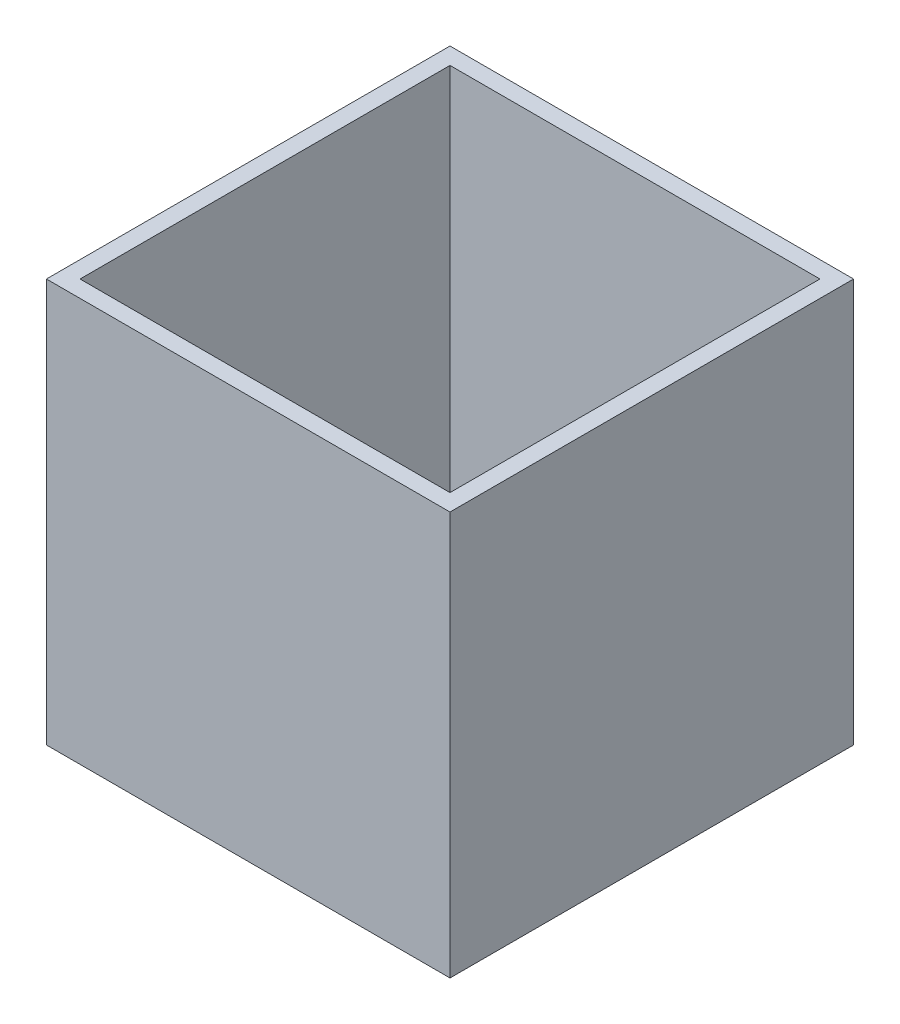
ISO-10303-21;
HEADER;
FILE_DESCRIPTION(('STEP AP214'),'2;1');
FILE_NAME('part.step','',(''),(''),'','','');
FILE_SCHEMA(('AUTOMOTIVE_DESIGN { 1 0 10303 214 1 1 1 1 }'));
ENDSEC;
DATA;
#1=APPLICATION_CONTEXT('core data for automotive mechanical design processes');
#2=APPLICATION_PROTOCOL_DEFINITION('international standard','automotive_design',2000,#1);
#3=PRODUCT_CONTEXT('',#1,'mechanical');
#4=PRODUCT('Part','Part','',(#3));
#5=PRODUCT_RELATED_PRODUCT_CATEGORY('part','',(#4));
#6=PRODUCT_DEFINITION_FORMATION('','',#4);
#7=PRODUCT_DEFINITION_CONTEXT('part definition',#1,'design');
#8=PRODUCT_DEFINITION('design','',#6,#7);
#9=PRODUCT_DEFINITION_SHAPE('','',#8);
#10=(LENGTH_UNIT() NAMED_UNIT(*) SI_UNIT(.MILLI.,.METRE.));
#11=(NAMED_UNIT(*) PLANE_ANGLE_UNIT() SI_UNIT($,.RADIAN.));
#12=(NAMED_UNIT(*) SI_UNIT($,.STERADIAN.) SOLID_ANGLE_UNIT());
#13=UNCERTAINTY_MEASURE_WITH_UNIT(LENGTH_MEASURE(1.E-05),#10,'distance_accuracy_value','');
#14=(GEOMETRIC_REPRESENTATION_CONTEXT(3) GLOBAL_UNCERTAINTY_ASSIGNED_CONTEXT((#13)) GLOBAL_UNIT_ASSIGNED_CONTEXT((#10,
#11,#12)) REPRESENTATION_CONTEXT('',''));
#15=CARTESIAN_POINT('',(0.,0.,0.));
#16=DIRECTION('',(0.,0.,1.));
#17=DIRECTION('',(1.,0.,0.));
#18=AXIS2_PLACEMENT_3D('',#15,#16,#17);
#19=CARTESIAN_POINT('',(-11.0771927684468,-36.9452985585913,304.8));
#20=DIRECTION('',(0.,1.,0.));
#21=DIRECTION('',(0.,0.,1.));
#22=AXIS2_PLACEMENT_3D('',#19,#20,#21);
#23=PLANE('',#22);
#24=CARTESIAN_POINT('',(115.822807231553,-36.9452985585913,131.4));
#25=DIRECTION('',(0.,1.,0.));
#26=DIRECTION('',(0.,0.,1.));
#27=AXIS2_PLACEMENT_3D('',#24,#25,#26);
#28=CIRCLE('',#27,3.87779457302715);
#29=CARTESIAN_POINT('',(115.822807231553,-36.9452985585913,135.277794573027));
#30=VERTEX_POINT('',#29);
#31=EDGE_CURVE('E237',#30,#30,#28,.T.);
#32=ORIENTED_EDGE('',*,*,#31,.F.);
#33=EDGE_LOOP('',(#32));
#34=FACE_BOUND('',#33,.T.);
#35=DIRECTION('',(1.,0.,0.));
#36=VECTOR('',#35,1.);
#37=CARTESIAN_POINT('',(-11.0771927684468,-36.9452985585913,12.7));
#38=LINE('',#37,#36);
#39=CARTESIAN_POINT('',(1.62280723155324,-36.9452985585913,12.7));
#40=VERTEX_POINT('',#39);
#41=CARTESIAN_POINT('',(281.022807231553,-36.9452985585913,12.7));
#42=VERTEX_POINT('',#41);
#43=EDGE_CURVE('E314',#40,#42,#38,.T.);
#44=ORIENTED_EDGE('',*,*,#43,.F.);
#45=DIRECTION('',(0.,0.,-1.));
#46=VECTOR('',#45,1.);
#47=CARTESIAN_POINT('',(1.62280723155324,-36.9452985585913,304.8));
#48=LINE('',#47,#46);
#49=CARTESIAN_POINT('',(1.62280723155324,-36.9452985585913,292.1));
#50=VERTEX_POINT('',#49);
#51=EDGE_CURVE('E315',#50,#40,#48,.T.);
#52=ORIENTED_EDGE('',*,*,#51,.F.);
#53=DIRECTION('',(1.,0.,0.));
#54=VECTOR('',#53,1.);
#55=CARTESIAN_POINT('',(-11.0771927684468,-36.9452985585913,292.1));
#56=LINE('',#55,#54);
#57=CARTESIAN_POINT('',(281.022807231553,-36.9452985585913,292.1));
#58=VERTEX_POINT('',#57);
#59=EDGE_CURVE('E325',#50,#58,#56,.T.);
#60=ORIENTED_EDGE('',*,*,#59,.T.);
#61=DIRECTION('',(0.,0.,-1.));
#62=VECTOR('',#61,1.);
#63=CARTESIAN_POINT('',(281.022807231553,-36.9452985585914,304.8));
#64=LINE('',#63,#62);
#65=EDGE_CURVE('E320',#58,#42,#64,.T.);
#66=ORIENTED_EDGE('',*,*,#65,.T.);
#67=EDGE_LOOP('',(#44,#52,#60,#66));
#68=FACE_BOUND('',#67,.T.);
#69=CARTESIAN_POINT('',(115.822807231553,-36.9452985585913,173.4));
#70=DIRECTION('',(0.,1.,0.));
#71=DIRECTION('',(0.,0.,1.));
#72=AXIS2_PLACEMENT_3D('',#69,#70,#71);
#73=CIRCLE('',#72,3.87779457302714);
#74=CARTESIAN_POINT('',(117.492325350832,-36.9452985585913,176.9));
#75=VERTEX_POINT('',#74);
#76=CARTESIAN_POINT('',(112.322807231553,-36.9452985585913,171.730481880722));
#77=VERTEX_POINT('',#76);
#78=EDGE_CURVE('E220',#75,#77,#73,.T.);
#79=ORIENTED_EDGE('',*,*,#78,.F.);
#80=DIRECTION('',(1.,0.,0.));
#81=VECTOR('',#80,1.);
#82=CARTESIAN_POINT('',(0.,-36.9452985585913,176.9));
#83=LINE('',#82,#81);
#84=CARTESIAN_POINT('',(114.153289112275,-36.9452985585913,176.9));
#85=VERTEX_POINT('',#84);
#86=EDGE_CURVE('E215',#85,#75,#83,.T.);
#87=ORIENTED_EDGE('',*,*,#86,.F.);
#88=CARTESIAN_POINT('',(112.322807231553,-36.9452985585913,175.069518119278));
#89=VERTEX_POINT('',#88);
#90=EDGE_CURVE('E283',#89,#85,#73,.T.);
#91=ORIENTED_EDGE('',*,*,#90,.F.);
#92=DIRECTION('',(0.,0.,1.));
#93=VECTOR('',#92,1.);
#94=CARTESIAN_POINT('',(112.322807231553,-36.9452985585913,0.));
#95=LINE('',#94,#93);
#96=EDGE_CURVE('E292',#77,#89,#95,.T.);
#97=ORIENTED_EDGE('',*,*,#96,.F.);
#98=EDGE_LOOP('',(#79,#87,#91,#97));
#99=FACE_BOUND('',#98,.T.);
#100=CARTESIAN_POINT('',(166.822807231553,-36.9452985585913,173.4));
#101=DIRECTION('',(0.,1.,0.));
#102=DIRECTION('',(0.,0.,1.));
#103=AXIS2_PLACEMENT_3D('',#100,#101,#102);
#104=CIRCLE('',#103,3.87779457302715);
#105=CARTESIAN_POINT('',(168.492325350832,-36.9452985585913,176.9));
#106=VERTEX_POINT('',#105);
#107=CARTESIAN_POINT('',(170.322807231553,-36.9452985585913,175.069518119278));
#108=VERTEX_POINT('',#107);
#109=EDGE_CURVE('E201',#106,#108,#104,.T.);
#110=ORIENTED_EDGE('',*,*,#109,.F.);
#111=DIRECTION('',(1.,0.,0.));
#112=VECTOR('',#111,1.);
#113=CARTESIAN_POINT('',(0.,-36.9452985585913,176.9));
#114=LINE('',#113,#112);
#115=CARTESIAN_POINT('',(165.153289112275,-36.9452985585913,176.9));
#116=VERTEX_POINT('',#115);
#117=EDGE_CURVE('E206',#116,#106,#114,.T.);
#118=ORIENTED_EDGE('',*,*,#117,.F.);
#119=CARTESIAN_POINT('',(170.322807231553,-36.9452985585913,171.730481880722));
#120=VERTEX_POINT('',#119);
#121=EDGE_CURVE('E189',#120,#116,#104,.T.);
#122=ORIENTED_EDGE('',*,*,#121,.F.);
#123=DIRECTION('',(0.,0.,1.));
#124=VECTOR('',#123,1.);
#125=CARTESIAN_POINT('',(170.322807231553,-36.9452985585913,0.));
#126=LINE('',#125,#124);
#127=EDGE_CURVE('E75',#120,#108,#126,.T.);
#128=ORIENTED_EDGE('',*,*,#127,.T.);
#129=EDGE_LOOP('',(#110,#118,#122,#128));
#130=FACE_BOUND('',#129,.T.);
#131=DIRECTION('',(0.,0.,1.));
#132=VECTOR('',#131,1.);
#133=CARTESIAN_POINT('',(170.322807231553,-36.9452985585913,0.));
#134=LINE('',#133,#132);
#135=CARTESIAN_POINT('',(170.322807231553,-36.9452985585913,129.730481880722));
#136=VERTEX_POINT('',#135);
#137=CARTESIAN_POINT('',(170.322807231553,-36.9452985585913,133.069518119278));
#138=VERTEX_POINT('',#137);
#139=EDGE_CURVE('E254',#136,#138,#134,.T.);
#140=ORIENTED_EDGE('',*,*,#139,.T.);
#141=CARTESIAN_POINT('',(166.822807231553,-36.9452985585913,131.4));
#142=DIRECTION('',(0.,1.,0.));
#143=DIRECTION('',(0.,0.,1.));
#144=AXIS2_PLACEMENT_3D('',#141,#142,#143);
#145=CIRCLE('',#144,3.87779457302718);
#146=CARTESIAN_POINT('',(165.153289112275,-36.9452985585913,127.9));
#147=VERTEX_POINT('',#146);
#148=EDGE_CURVE('E250',#147,#138,#145,.T.);
#149=ORIENTED_EDGE('',*,*,#148,.F.);
#150=DIRECTION('',(1.,0.,0.));
#151=VECTOR('',#150,1.);
#152=CARTESIAN_POINT('',(0.,-36.9452985585913,127.9));
#153=LINE('',#152,#151);
#154=CARTESIAN_POINT('',(168.492325350832,-36.9452985585913,127.9));
#155=VERTEX_POINT('',#154);
#156=EDGE_CURVE('E67',#147,#155,#153,.T.);
#157=ORIENTED_EDGE('',*,*,#156,.T.);
#158=EDGE_CURVE('E249',#136,#155,#145,.T.);
#159=ORIENTED_EDGE('',*,*,#158,.F.);
#160=EDGE_LOOP('',(#140,#149,#157,#159));
#161=FACE_BOUND('',#160,.T.);
#162=ADVANCED_FACE('F51',(#34,#68,#99,#130,#161),#23,.T.);
#163=CARTESIAN_POINT('',(-11.0771927684467,255.154701441409,304.8));
#164=DIRECTION('',(0.,-1.,0.));
#165=DIRECTION('',(0.,0.,-1.));
#166=AXIS2_PLACEMENT_3D('',#163,#164,#165);
#167=PLANE('',#166);
#168=DIRECTION('',(-1.,0.,0.));
#169=VECTOR('',#168,1.);
#170=CARTESIAN_POINT('',(-11.0771927684467,255.154701441409,0.));
#171=LINE('',#170,#169);
#172=CARTESIAN_POINT('',(293.722807231553,255.154701441409,0.));
#173=VERTEX_POINT('',#172);
#174=CARTESIAN_POINT('',(-11.0771927684467,255.154701441409,0.));
#175=VERTEX_POINT('',#174);
#176=EDGE_CURVE('E360',#173,#175,#171,.T.);
#177=ORIENTED_EDGE('',*,*,#176,.T.);
#178=DIRECTION('',(0.,0.,-1.));
#179=VECTOR('',#178,1.);
#180=CARTESIAN_POINT('',(-11.0771927684467,255.154701441409,304.8));
#181=LINE('',#180,#179);
#182=CARTESIAN_POINT('',(-11.0771927684467,255.154701441409,304.8));
#183=VERTEX_POINT('',#182);
#184=EDGE_CURVE('E369',#183,#175,#181,.T.);
#185=ORIENTED_EDGE('',*,*,#184,.F.);
#186=DIRECTION('',(-1.,0.,0.));
#187=VECTOR('',#186,1.);
#188=CARTESIAN_POINT('',(-11.0771927684467,255.154701441409,304.8));
#189=LINE('',#188,#187);
#190=CARTESIAN_POINT('',(293.722807231553,255.154701441409,304.8));
#191=VERTEX_POINT('',#190);
#192=EDGE_CURVE('E366',#191,#183,#189,.T.);
#193=ORIENTED_EDGE('',*,*,#192,.F.);
#194=DIRECTION('',(0.,0.,-1.));
#195=VECTOR('',#194,1.);
#196=CARTESIAN_POINT('',(293.722807231553,255.154701441409,304.8));
#197=LINE('',#196,#195);
#198=EDGE_CURVE('E384',#191,#173,#197,.T.);
#199=ORIENTED_EDGE('',*,*,#198,.T.);
#200=EDGE_LOOP('',(#177,#185,#193,#199));
#201=FACE_BOUND('',#200,.T.);
#202=DIRECTION('',(-1.,0.,0.));
#203=VECTOR('',#202,1.);
#204=CARTESIAN_POINT('',(-11.0771927684467,255.154701441409,12.7));
#205=LINE('',#204,#203);
#206=CARTESIAN_POINT('',(281.022807231553,255.154701441409,12.7));
#207=VERTEX_POINT('',#206);
#208=CARTESIAN_POINT('',(1.62280723155329,255.154701441409,12.7));
#209=VERTEX_POINT('',#208);
#210=EDGE_CURVE('E326',#207,#209,#205,.T.);
#211=ORIENTED_EDGE('',*,*,#210,.F.);
#212=DIRECTION('',(0.,0.,-1.));
#213=VECTOR('',#212,1.);
#214=CARTESIAN_POINT('',(281.022807231553,255.154701441409,304.8));
#215=LINE('',#214,#213);
#216=CARTESIAN_POINT('',(281.022807231553,255.154701441409,292.1));
#217=VERTEX_POINT('',#216);
#218=EDGE_CURVE('E333',#217,#207,#215,.T.);
#219=ORIENTED_EDGE('',*,*,#218,.F.);
#220=DIRECTION('',(-1.,0.,0.));
#221=VECTOR('',#220,1.);
#222=CARTESIAN_POINT('',(-11.0771927684467,255.154701441409,292.1));
#223=LINE('',#222,#221);
#224=CARTESIAN_POINT('',(1.62280723155329,255.154701441409,292.1));
#225=VERTEX_POINT('',#224);
#226=EDGE_CURVE('E342',#217,#225,#223,.T.);
#227=ORIENTED_EDGE('',*,*,#226,.T.);
#228=DIRECTION('',(0.,0.,-1.));
#229=VECTOR('',#228,1.);
#230=CARTESIAN_POINT('',(1.62280723155329,255.154701441409,304.8));
#231=LINE('',#230,#229);
#232=EDGE_CURVE('E343',#225,#209,#231,.T.);
#233=ORIENTED_EDGE('',*,*,#232,.T.);
#234=EDGE_LOOP('',(#211,#219,#227,#233));
#235=FACE_BOUND('',#234,.T.);
#236=ADVANCED_FACE('F402',(#201,#235),#167,.F.);
#237=CARTESIAN_POINT('',(-11.0771927684467,255.154701441409,304.8));
#238=DIRECTION('',(1.,0.,0.));
#239=DIRECTION('',(0.,1.,0.));
#240=AXIS2_PLACEMENT_3D('',#237,#238,#239);
#241=PLANE('',#240);
#242=DIRECTION('',(0.,-1.,0.));
#243=VECTOR('',#242,1.);
#244=CARTESIAN_POINT('',(-11.0771927684467,255.154701441409,0.));
#245=LINE('',#244,#243);
#246=CARTESIAN_POINT('',(-11.0771927684468,-49.6452985585913,0.));
#247=VERTEX_POINT('',#246);
#248=EDGE_CURVE('E319',#175,#247,#245,.T.);
#249=ORIENTED_EDGE('',*,*,#248,.T.);
#250=DIRECTION('',(0.,0.,-1.));
#251=VECTOR('',#250,1.);
#252=CARTESIAN_POINT('',(-11.0771927684468,-49.6452985585913,304.8));
#253=LINE('',#252,#251);
#254=CARTESIAN_POINT('',(-11.0771927684468,-49.6452985585913,304.8));
#255=VERTEX_POINT('',#254);
#256=EDGE_CURVE('E11',#255,#247,#253,.T.);
#257=ORIENTED_EDGE('',*,*,#256,.F.);
#258=DIRECTION('',(0.,-1.,0.));
#259=VECTOR('',#258,1.);
#260=CARTESIAN_POINT('',(-11.0771927684467,255.154701441409,304.8));
#261=LINE('',#260,#259);
#262=EDGE_CURVE('E355',#183,#255,#261,.T.);
#263=ORIENTED_EDGE('',*,*,#262,.F.);
#264=ORIENTED_EDGE('',*,*,#184,.T.);
#265=EDGE_LOOP('',(#249,#257,#263,#264));
#266=FACE_BOUND('',#265,.T.);
#267=ADVANCED_FACE('F53',(#266),#241,.F.);
#268=CARTESIAN_POINT('',(-11.0771927684468,-49.6452985585913,304.8));
#269=DIRECTION('',(0.,1.,0.));
#270=DIRECTION('',(0.,0.,1.));
#271=AXIS2_PLACEMENT_3D('',#268,#269,#270);
#272=PLANE('',#271);
#273=CARTESIAN_POINT('',(115.822807231553,-49.6452985585913,131.4));
#274=DIRECTION('',(0.,1.,0.));
#275=DIRECTION('',(0.,0.,1.));
#276=AXIS2_PLACEMENT_3D('',#273,#274,#275);
#277=CIRCLE('',#276,1.02499999999999);
#278=CARTESIAN_POINT('',(115.822807231553,-49.6452985585913,132.425));
#279=VERTEX_POINT('',#278);
#280=EDGE_CURVE('E707',#279,#279,#277,.T.);
#281=ORIENTED_EDGE('',*,*,#280,.T.);
#282=EDGE_LOOP('',(#281));
#283=FACE_BOUND('',#282,.T.);
#284=CARTESIAN_POINT('',(166.822807231553,-49.6452985585913,131.4));
#285=DIRECTION('',(0.,1.,0.));
#286=DIRECTION('',(0.,0.,1.));
#287=AXIS2_PLACEMENT_3D('',#284,#285,#286);
#288=CIRCLE('',#287,1.025);
#289=CARTESIAN_POINT('',(166.822807231553,-49.6452985585913,132.425));
#290=VERTEX_POINT('',#289);
#291=EDGE_CURVE('E720',#290,#290,#288,.T.);
#292=ORIENTED_EDGE('',*,*,#291,.T.);
#293=EDGE_LOOP('',(#292));
#294=FACE_BOUND('',#293,.T.);
#295=CARTESIAN_POINT('',(166.822807231553,-49.6452985585913,173.4));
#296=DIRECTION('',(0.,1.,0.));
#297=DIRECTION('',(0.,0.,1.));
#298=AXIS2_PLACEMENT_3D('',#295,#296,#297);
#299=CIRCLE('',#298,1.025);
#300=CARTESIAN_POINT('',(166.822807231553,-49.6452985585913,174.425));
#301=VERTEX_POINT('',#300);
#302=EDGE_CURVE('E728',#301,#301,#299,.T.);
#303=ORIENTED_EDGE('',*,*,#302,.T.);
#304=EDGE_LOOP('',(#303));
#305=FACE_BOUND('',#304,.T.);
#306=CARTESIAN_POINT('',(115.822807231553,-49.6452985585913,173.4));
#307=DIRECTION('',(0.,1.,0.));
#308=DIRECTION('',(0.,0.,1.));
#309=AXIS2_PLACEMENT_3D('',#306,#307,#308);
#310=CIRCLE('',#309,1.02499999999999);
#311=CARTESIAN_POINT('',(115.822807231553,-49.6452985585913,174.425));
#312=VERTEX_POINT('',#311);
#313=EDGE_CURVE('E277',#312,#312,#310,.T.);
#314=ORIENTED_EDGE('',*,*,#313,.T.);
#315=EDGE_LOOP('',(#314));
#316=FACE_BOUND('',#315,.T.);
#317=DIRECTION('',(1.,0.,0.));
#318=VECTOR('',#317,1.);
#319=CARTESIAN_POINT('',(-11.0771927684468,-49.6452985585913,0.));
#320=LINE('',#319,#318);
#321=CARTESIAN_POINT('',(293.722807231553,-49.6452985585913,0.));
#322=VERTEX_POINT('',#321);
#323=EDGE_CURVE('E373',#247,#322,#320,.T.);
#324=ORIENTED_EDGE('',*,*,#323,.T.);
#325=DIRECTION('',(0.,0.,-1.));
#326=VECTOR('',#325,1.);
#327=CARTESIAN_POINT('',(293.722807231553,-49.6452985585913,304.8));
#328=LINE('',#327,#326);
#329=CARTESIAN_POINT('',(293.722807231553,-49.6452985585913,304.8));
#330=VERTEX_POINT('',#329);
#331=EDGE_CURVE('E60',#330,#322,#328,.T.);
#332=ORIENTED_EDGE('',*,*,#331,.F.);
#333=DIRECTION('',(1.,0.,0.));
#334=VECTOR('',#333,1.);
#335=CARTESIAN_POINT('',(-11.0771927684468,-49.6452985585913,304.8));
#336=LINE('',#335,#334);
#337=EDGE_CURVE('E359',#255,#330,#336,.T.);
#338=ORIENTED_EDGE('',*,*,#337,.F.);
#339=ORIENTED_EDGE('',*,*,#256,.T.);
#340=EDGE_LOOP('',(#324,#332,#338,#339));
#341=FACE_BOUND('',#340,.T.);
#342=ADVANCED_FACE('F410',(#283,#294,#305,#316,#341),#272,.F.);
#343=CARTESIAN_POINT('',(293.722807231553,255.154701441409,304.8));
#344=DIRECTION('',(-1.,0.,0.));
#345=DIRECTION('',(0.,-1.,0.));
#346=AXIS2_PLACEMENT_3D('',#343,#344,#345);
#347=PLANE('',#346);
#348=DIRECTION('',(0.,1.,0.));
#349=VECTOR('',#348,1.);
#350=CARTESIAN_POINT('',(293.722807231553,255.154701441409,0.));
#351=LINE('',#350,#349);
#352=EDGE_CURVE('E376',#322,#173,#351,.T.);
#353=ORIENTED_EDGE('',*,*,#352,.T.);
#354=ORIENTED_EDGE('',*,*,#198,.F.);
#355=DIRECTION('',(0.,1.,0.));
#356=VECTOR('',#355,1.);
#357=CARTESIAN_POINT('',(293.722807231553,255.154701441409,304.8));
#358=LINE('',#357,#356);
#359=EDGE_CURVE('E363',#330,#191,#358,.T.);
#360=ORIENTED_EDGE('',*,*,#359,.F.);
#361=ORIENTED_EDGE('',*,*,#331,.T.);
#362=EDGE_LOOP('',(#353,#354,#360,#361));
#363=FACE_BOUND('',#362,.T.);
#364=ADVANCED_FACE('F393',(#363),#347,.F.);
#365=CARTESIAN_POINT('',(0.,0.,304.8));
#366=DIRECTION('',(0.,0.,1.));
#367=DIRECTION('',(1.,0.,0.));
#368=AXIS2_PLACEMENT_3D('',#365,#366,#367);
#369=PLANE('',#368);
#370=ORIENTED_EDGE('',*,*,#262,.T.);
#371=ORIENTED_EDGE('',*,*,#337,.T.);
#372=ORIENTED_EDGE('',*,*,#359,.T.);
#373=ORIENTED_EDGE('',*,*,#192,.T.);
#374=EDGE_LOOP('',(#370,#371,#372,#373));
#375=FACE_BOUND('',#374,.T.);
#376=ADVANCED_FACE('F409',(#375),#369,.T.);
#377=CARTESIAN_POINT('',(0.,0.,0.));
#378=DIRECTION('',(0.,0.,1.));
#379=DIRECTION('',(1.,0.,0.));
#380=AXIS2_PLACEMENT_3D('',#377,#378,#379);
#381=PLANE('',#380);
#382=ORIENTED_EDGE('',*,*,#248,.F.);
#383=ORIENTED_EDGE('',*,*,#176,.F.);
#384=ORIENTED_EDGE('',*,*,#352,.F.);
#385=ORIENTED_EDGE('',*,*,#323,.F.);
#386=EDGE_LOOP('',(#382,#383,#384,#385));
#387=FACE_BOUND('',#386,.T.);
#388=ADVANCED_FACE('F399',(#387),#381,.F.);
#389=CARTESIAN_POINT('',(1.62280723155329,255.154701441409,304.8));
#390=DIRECTION('',(1.,0.,0.));
#391=DIRECTION('',(0.,1.,0.));
#392=AXIS2_PLACEMENT_3D('',#389,#390,#391);
#393=PLANE('',#392);
#394=DIRECTION('',(0.,-1.,0.));
#395=VECTOR('',#394,1.);
#396=CARTESIAN_POINT('',(1.62280723155329,255.154701441409,12.7));
#397=LINE('',#396,#395);
#398=EDGE_CURVE('E310',#209,#40,#397,.T.);
#399=ORIENTED_EDGE('',*,*,#398,.F.);
#400=ORIENTED_EDGE('',*,*,#232,.F.);
#401=DIRECTION('',(0.,-1.,0.));
#402=VECTOR('',#401,1.);
#403=CARTESIAN_POINT('',(1.62280723155329,255.154701441409,292.1));
#404=LINE('',#403,#402);
#405=EDGE_CURVE('E321',#225,#50,#404,.T.);
#406=ORIENTED_EDGE('',*,*,#405,.T.);
#407=ORIENTED_EDGE('',*,*,#51,.T.);
#408=EDGE_LOOP('',(#399,#400,#406,#407));
#409=FACE_BOUND('',#408,.T.);
#410=ADVANCED_FACE('F435',(#409),#393,.T.);
#411=CARTESIAN_POINT('',(281.022807231553,255.154701441409,304.8));
#412=DIRECTION('',(-1.,0.,0.));
#413=DIRECTION('',(0.,-1.,0.));
#414=AXIS2_PLACEMENT_3D('',#411,#412,#413);
#415=PLANE('',#414);
#416=DIRECTION('',(0.,1.,0.));
#417=VECTOR('',#416,1.);
#418=CARTESIAN_POINT('',(281.022807231553,255.154701441409,12.7));
#419=LINE('',#418,#417);
#420=EDGE_CURVE('E329',#42,#207,#419,.T.);
#421=ORIENTED_EDGE('',*,*,#420,.F.);
#422=ORIENTED_EDGE('',*,*,#65,.F.);
#423=DIRECTION('',(0.,1.,0.));
#424=VECTOR('',#423,1.);
#425=CARTESIAN_POINT('',(281.022807231553,255.154701441409,292.1));
#426=LINE('',#425,#424);
#427=EDGE_CURVE('E336',#58,#217,#426,.T.);
#428=ORIENTED_EDGE('',*,*,#427,.T.);
#429=ORIENTED_EDGE('',*,*,#218,.T.);
#430=EDGE_LOOP('',(#421,#422,#428,#429));
#431=FACE_BOUND('',#430,.T.);
#432=ADVANCED_FACE('F437',(#431),#415,.T.);
#433=CARTESIAN_POINT('',(0.,0.,292.1));
#434=DIRECTION('',(0.,0.,1.));
#435=DIRECTION('',(1.,0.,0.));
#436=AXIS2_PLACEMENT_3D('',#433,#434,#435);
#437=PLANE('',#436);
#438=ORIENTED_EDGE('',*,*,#405,.F.);
#439=ORIENTED_EDGE('',*,*,#226,.F.);
#440=ORIENTED_EDGE('',*,*,#427,.F.);
#441=ORIENTED_EDGE('',*,*,#59,.F.);
#442=EDGE_LOOP('',(#438,#439,#440,#441));
#443=FACE_BOUND('',#442,.T.);
#444=ADVANCED_FACE('F440',(#443),#437,.F.);
#445=CARTESIAN_POINT('',(0.,0.,12.7));
#446=DIRECTION('',(0.,0.,1.));
#447=DIRECTION('',(1.,0.,0.));
#448=AXIS2_PLACEMENT_3D('',#445,#446,#447);
#449=PLANE('',#448);
#450=ORIENTED_EDGE('',*,*,#398,.T.);
#451=ORIENTED_EDGE('',*,*,#43,.T.);
#452=ORIENTED_EDGE('',*,*,#420,.T.);
#453=ORIENTED_EDGE('',*,*,#210,.T.);
#454=EDGE_LOOP('',(#450,#451,#452,#453));
#455=FACE_BOUND('',#454,.T.);
#456=ADVANCED_FACE('F444',(#455),#449,.T.);
#457=CARTESIAN_POINT('',(0.,-30.9452985585913,176.9));
#458=DIRECTION('',(0.,0.,-1.));
#459=DIRECTION('',(-1.,0.,0.));
#460=AXIS2_PLACEMENT_3D('',#457,#458,#459);
#461=PLANE('',#460);
#462=ORIENTED_EDGE('',*,*,#86,.T.);
#463=DIRECTION('',(0.,-1.,0.));
#464=VECTOR('',#463,1.);
#465=CARTESIAN_POINT('',(117.492325350832,-30.9452985585913,176.9));
#466=LINE('',#465,#464);
#467=CARTESIAN_POINT('',(117.492325350832,-30.9452985585913,176.9));
#468=VERTEX_POINT('',#467);
#469=EDGE_CURVE('E307',#468,#75,#466,.T.);
#470=ORIENTED_EDGE('',*,*,#469,.F.);
#471=DIRECTION('',(1.,0.,0.));
#472=VECTOR('',#471,1.);
#473=CARTESIAN_POINT('',(0.,-30.9452985585913,176.9));
#474=LINE('',#473,#472);
#475=CARTESIAN_POINT('',(114.153289112275,-30.9452985585913,176.9));
#476=VERTEX_POINT('',#475);
#477=EDGE_CURVE('E278',#476,#468,#474,.T.);
#478=ORIENTED_EDGE('',*,*,#477,.F.);
#479=DIRECTION('',(0.,-1.,0.));
#480=VECTOR('',#479,1.);
#481=CARTESIAN_POINT('',(114.153289112275,-30.9452985585913,176.9));
#482=LINE('',#481,#480);
#483=EDGE_CURVE('E296',#476,#85,#482,.T.);
#484=ORIENTED_EDGE('',*,*,#483,.T.);
#485=EDGE_LOOP('',(#462,#470,#478,#484));
#486=FACE_BOUND('',#485,.T.);
#487=ADVANCED_FACE('F447',(#486),#461,.F.);
#488=CARTESIAN_POINT('',(115.822807231553,-30.9452985585913,173.4));
#489=DIRECTION('',(0.,-1.,0.));
#490=DIRECTION('',(0.,0.,-1.));
#491=AXIS2_PLACEMENT_3D('',#488,#489,#490);
#492=CYLINDRICAL_SURFACE('',#491,3.87779457302714);
#493=ORIENTED_EDGE('',*,*,#78,.T.);
#494=DIRECTION('',(0.,-1.,0.));
#495=VECTOR('',#494,1.);
#496=CARTESIAN_POINT('',(112.322807231553,-30.9452985585913,171.730481880722));
#497=LINE('',#496,#495);
#498=CARTESIAN_POINT('',(112.322807231553,-30.9452985585913,171.730481880722));
#499=VERTEX_POINT('',#498);
#500=EDGE_CURVE('E303',#499,#77,#497,.T.);
#501=ORIENTED_EDGE('',*,*,#500,.F.);
#502=CARTESIAN_POINT('',(115.822807231553,-30.9452985585913,173.4));
#503=DIRECTION('',(0.,1.,0.));
#504=DIRECTION('',(0.,0.,1.));
#505=AXIS2_PLACEMENT_3D('',#502,#503,#504);
#506=CIRCLE('',#505,3.87779457302714);
#507=EDGE_CURVE('E282',#468,#499,#506,.T.);
#508=ORIENTED_EDGE('',*,*,#507,.F.);
#509=ORIENTED_EDGE('',*,*,#469,.T.);
#510=EDGE_LOOP('',(#493,#501,#508,#509));
#511=FACE_BOUND('',#510,.T.);
#512=ADVANCED_FACE('F473',(#511),#492,.T.);
#513=CARTESIAN_POINT('',(112.322807231553,-30.9452985585913,0.));
#514=DIRECTION('',(1.,0.,0.));
#515=DIRECTION('',(0.,0.,-1.));
#516=AXIS2_PLACEMENT_3D('',#513,#514,#515);
#517=PLANE('',#516);
#518=ORIENTED_EDGE('',*,*,#96,.T.);
#519=DIRECTION('',(0.,-1.,0.));
#520=VECTOR('',#519,1.);
#521=CARTESIAN_POINT('',(112.322807231553,-30.9452985585913,175.069518119278));
#522=LINE('',#521,#520);
#523=CARTESIAN_POINT('',(112.322807231553,-30.9452985585913,175.069518119278));
#524=VERTEX_POINT('',#523);
#525=EDGE_CURVE('E300',#524,#89,#522,.T.);
#526=ORIENTED_EDGE('',*,*,#525,.F.);
#527=DIRECTION('',(0.,0.,1.));
#528=VECTOR('',#527,1.);
#529=CARTESIAN_POINT('',(112.322807231553,-30.9452985585913,0.));
#530=LINE('',#529,#528);
#531=EDGE_CURVE('E286',#499,#524,#530,.T.);
#532=ORIENTED_EDGE('',*,*,#531,.F.);
#533=ORIENTED_EDGE('',*,*,#500,.T.);
#534=EDGE_LOOP('',(#518,#526,#532,#533));
#535=FACE_BOUND('',#534,.T.);
#536=ADVANCED_FACE('F477',(#535),#517,.F.);
#537=ORIENTED_EDGE('',*,*,#90,.T.);
#538=ORIENTED_EDGE('',*,*,#483,.F.);
#539=EDGE_CURVE('E287',#524,#476,#506,.T.);
#540=ORIENTED_EDGE('',*,*,#539,.F.);
#541=ORIENTED_EDGE('',*,*,#525,.T.);
#542=EDGE_LOOP('',(#537,#538,#540,#541));
#543=FACE_BOUND('',#542,.T.);
#544=ADVANCED_FACE('F486',(#543),#492,.T.);
#545=CARTESIAN_POINT('',(0.,-30.9452985585913,0.));
#546=DIRECTION('',(0.,1.,0.));
#547=DIRECTION('',(0.,0.,1.));
#548=AXIS2_PLACEMENT_3D('',#545,#546,#547);
#549=PLANE('',#548);
#550=CARTESIAN_POINT('',(115.822807231553,-30.9452985585913,173.4));
#551=DIRECTION('',(0.,1.,0.));
#552=DIRECTION('',(0.,0.,1.));
#553=AXIS2_PLACEMENT_3D('',#550,#551,#552);
#554=CIRCLE('',#553,1.02499999999998);
#555=CARTESIAN_POINT('',(115.822807231553,-30.9452985585913,174.425));
#556=VERTEX_POINT('',#555);
#557=EDGE_CURVE('E732',#556,#556,#554,.T.);
#558=ORIENTED_EDGE('',*,*,#557,.F.);
#559=EDGE_LOOP('',(#558));
#560=FACE_BOUND('',#559,.T.);
#561=ORIENTED_EDGE('',*,*,#477,.T.);
#562=ORIENTED_EDGE('',*,*,#507,.T.);
#563=ORIENTED_EDGE('',*,*,#531,.T.);
#564=ORIENTED_EDGE('',*,*,#539,.T.);
#565=EDGE_LOOP('',(#561,#562,#563,#564));
#566=FACE_BOUND('',#565,.T.);
#567=ADVANCED_FACE('F481',(#560,#566),#549,.T.);
#568=CARTESIAN_POINT('',(0.,-30.9452985585913,176.9));
#569=DIRECTION('',(0.,0.,-1.));
#570=DIRECTION('',(-1.,0.,0.));
#571=AXIS2_PLACEMENT_3D('',#568,#569,#570);
#572=PLANE('',#571);
#573=ORIENTED_EDGE('',*,*,#117,.T.);
#574=DIRECTION('',(0.,-1.,0.));
#575=VECTOR('',#574,1.);
#576=CARTESIAN_POINT('',(168.492325350832,-30.9452985585913,176.9));
#577=LINE('',#576,#575);
#578=CARTESIAN_POINT('',(168.492325350832,-30.9452985585913,176.9));
#579=VERTEX_POINT('',#578);
#580=EDGE_CURVE('E258',#579,#106,#577,.T.);
#581=ORIENTED_EDGE('',*,*,#580,.F.);
#582=DIRECTION('',(1.,0.,0.));
#583=VECTOR('',#582,1.);
#584=CARTESIAN_POINT('',(0.,-30.9452985585913,176.9));
#585=LINE('',#584,#583);
#586=CARTESIAN_POINT('',(165.153289112275,-30.9452985585913,176.9));
#587=VERTEX_POINT('',#586);
#588=EDGE_CURVE('E199',#587,#579,#585,.T.);
#589=ORIENTED_EDGE('',*,*,#588,.F.);
#590=DIRECTION('',(0.,-1.,0.));
#591=VECTOR('',#590,1.);
#592=CARTESIAN_POINT('',(165.153289112275,-30.9452985585913,176.9));
#593=LINE('',#592,#591);
#594=EDGE_CURVE('E193',#587,#116,#593,.T.);
#595=ORIENTED_EDGE('',*,*,#594,.T.);
#596=EDGE_LOOP('',(#573,#581,#589,#595));
#597=FACE_BOUND('',#596,.T.);
#598=ADVANCED_FACE('F204',(#597),#572,.F.);
#599=CARTESIAN_POINT('',(166.822807231553,-30.9452985585913,173.4));
#600=DIRECTION('',(0.,-1.,0.));
#601=DIRECTION('',(0.,0.,-1.));
#602=AXIS2_PLACEMENT_3D('',#599,#600,#601);
#603=CYLINDRICAL_SURFACE('',#602,3.87779457302715);
#604=ORIENTED_EDGE('',*,*,#109,.T.);
#605=DIRECTION('',(0.,-1.,0.));
#606=VECTOR('',#605,1.);
#607=CARTESIAN_POINT('',(170.322807231553,-30.9452985585913,175.069518119278));
#608=LINE('',#607,#606);
#609=CARTESIAN_POINT('',(170.322807231553,-30.9452985585913,175.069518119278));
#610=VERTEX_POINT('',#609);
#611=EDGE_CURVE('E741',#610,#108,#608,.T.);
#612=ORIENTED_EDGE('',*,*,#611,.F.);
#613=CARTESIAN_POINT('',(166.822807231553,-30.9452985585913,173.4));
#614=DIRECTION('',(0.,1.,0.));
#615=DIRECTION('',(0.,0.,1.));
#616=AXIS2_PLACEMENT_3D('',#613,#614,#615);
#617=CIRCLE('',#616,3.87779457302715);
#618=EDGE_CURVE('E228',#579,#610,#617,.T.);
#619=ORIENTED_EDGE('',*,*,#618,.F.);
#620=ORIENTED_EDGE('',*,*,#580,.T.);
#621=EDGE_LOOP('',(#604,#612,#619,#620));
#622=FACE_BOUND('',#621,.T.);
#623=ADVANCED_FACE('F538',(#622),#603,.T.);
#624=CARTESIAN_POINT('',(170.322807231553,-30.9452985585913,0.));
#625=DIRECTION('',(1.,0.,0.));
#626=DIRECTION('',(0.,0.,-1.));
#627=AXIS2_PLACEMENT_3D('',#624,#625,#626);
#628=PLANE('',#627);
#629=ORIENTED_EDGE('',*,*,#127,.F.);
#630=DIRECTION('',(0.,-1.,0.));
#631=VECTOR('',#630,1.);
#632=CARTESIAN_POINT('',(170.322807231553,-30.9452985585913,171.730481880722));
#633=LINE('',#632,#631);
#634=CARTESIAN_POINT('',(170.322807231553,-30.9452985585913,171.730481880722));
#635=VERTEX_POINT('',#634);
#636=EDGE_CURVE('E195',#635,#120,#633,.T.);
#637=ORIENTED_EDGE('',*,*,#636,.F.);
#638=DIRECTION('',(0.,0.,1.));
#639=VECTOR('',#638,1.);
#640=CARTESIAN_POINT('',(170.322807231553,-30.9452985585913,0.));
#641=LINE('',#640,#639);
#642=EDGE_CURVE('E224',#635,#610,#641,.T.);
#643=ORIENTED_EDGE('',*,*,#642,.T.);
#644=ORIENTED_EDGE('',*,*,#611,.T.);
#645=EDGE_LOOP('',(#629,#637,#643,#644));
#646=FACE_BOUND('',#645,.T.);
#647=ADVANCED_FACE('F547',(#646),#628,.T.);
#648=ORIENTED_EDGE('',*,*,#121,.T.);
#649=ORIENTED_EDGE('',*,*,#594,.F.);
#650=EDGE_CURVE('E210',#635,#587,#617,.T.);
#651=ORIENTED_EDGE('',*,*,#650,.F.);
#652=ORIENTED_EDGE('',*,*,#636,.T.);
#653=EDGE_LOOP('',(#648,#649,#651,#652));
#654=FACE_BOUND('',#653,.T.);
#655=ADVANCED_FACE('F191',(#654),#603,.T.);
#656=CARTESIAN_POINT('',(0.,-30.9452985585913,0.));
#657=DIRECTION('',(0.,1.,0.));
#658=DIRECTION('',(0.,0.,1.));
#659=AXIS2_PLACEMENT_3D('',#656,#657,#658);
#660=PLANE('',#659);
#661=CARTESIAN_POINT('',(166.822807231553,-30.9452985585913,173.4));
#662=DIRECTION('',(0.,1.,0.));
#663=DIRECTION('',(0.,0.,1.));
#664=AXIS2_PLACEMENT_3D('',#661,#662,#663);
#665=CIRCLE('',#664,1.025);
#666=CARTESIAN_POINT('',(166.822807231553,-30.9452985585913,174.425));
#667=VERTEX_POINT('',#666);
#668=EDGE_CURVE('E724',#667,#667,#665,.T.);
#669=ORIENTED_EDGE('',*,*,#668,.F.);
#670=EDGE_LOOP('',(#669));
#671=FACE_BOUND('',#670,.T.);
#672=ORIENTED_EDGE('',*,*,#588,.T.);
#673=ORIENTED_EDGE('',*,*,#618,.T.);
#674=ORIENTED_EDGE('',*,*,#642,.F.);
#675=ORIENTED_EDGE('',*,*,#650,.T.);
#676=EDGE_LOOP('',(#672,#673,#674,#675));
#677=FACE_BOUND('',#676,.T.);
#678=ADVANCED_FACE('F565',(#671,#677),#660,.T.);
#679=CARTESIAN_POINT('',(170.322807231553,-30.9452985585913,0.));
#680=DIRECTION('',(1.,0.,0.));
#681=DIRECTION('',(0.,0.,-1.));
#682=AXIS2_PLACEMENT_3D('',#679,#680,#681);
#683=PLANE('',#682);
#684=ORIENTED_EDGE('',*,*,#139,.F.);
#685=DIRECTION('',(0.,-1.,0.));
#686=VECTOR('',#685,1.);
#687=CARTESIAN_POINT('',(170.322807231553,-30.9452985585913,129.730481880722));
#688=LINE('',#687,#686);
#689=CARTESIAN_POINT('',(170.322807231553,-30.9452985585913,129.730481880722));
#690=VERTEX_POINT('',#689);
#691=EDGE_CURVE('E233',#690,#136,#688,.T.);
#692=ORIENTED_EDGE('',*,*,#691,.F.);
#693=DIRECTION('',(0.,0.,1.));
#694=VECTOR('',#693,1.);
#695=CARTESIAN_POINT('',(170.322807231553,-30.9452985585913,0.));
#696=LINE('',#695,#694);
#697=CARTESIAN_POINT('',(170.322807231553,-30.9452985585913,133.069518119278));
#698=VERTEX_POINT('',#697);
#699=EDGE_CURVE('E266',#690,#698,#696,.T.);
#700=ORIENTED_EDGE('',*,*,#699,.T.);
#701=DIRECTION('',(0.,-1.,0.));
#702=VECTOR('',#701,1.);
#703=CARTESIAN_POINT('',(170.322807231553,-30.9452985585913,133.069518119278));
#704=LINE('',#703,#702);
#705=EDGE_CURVE('E243',#698,#138,#704,.T.);
#706=ORIENTED_EDGE('',*,*,#705,.T.);
#707=EDGE_LOOP('',(#684,#692,#700,#706));
#708=FACE_BOUND('',#707,.T.);
#709=ADVANCED_FACE('F574',(#708),#683,.T.);
#710=CARTESIAN_POINT('',(166.822807231553,-30.9452985585913,131.4));
#711=DIRECTION('',(0.,-1.,0.));
#712=DIRECTION('',(0.,0.,-1.));
#713=AXIS2_PLACEMENT_3D('',#710,#711,#712);
#714=CYLINDRICAL_SURFACE('',#713,3.87779457302718);
#715=ORIENTED_EDGE('',*,*,#158,.T.);
#716=DIRECTION('',(0.,-1.,0.));
#717=VECTOR('',#716,1.);
#718=CARTESIAN_POINT('',(168.492325350832,-30.9452985585913,127.9));
#719=LINE('',#718,#717);
#720=CARTESIAN_POINT('',(168.492325350832,-30.9452985585913,127.9));
#721=VERTEX_POINT('',#720);
#722=EDGE_CURVE('E236',#721,#155,#719,.T.);
#723=ORIENTED_EDGE('',*,*,#722,.F.);
#724=CARTESIAN_POINT('',(166.822807231553,-30.9452985585913,131.4));
#725=DIRECTION('',(0.,1.,0.));
#726=DIRECTION('',(0.,0.,1.));
#727=AXIS2_PLACEMENT_3D('',#724,#725,#726);
#728=CIRCLE('',#727,3.87779457302718);
#729=EDGE_CURVE('E263',#690,#721,#728,.T.);
#730=ORIENTED_EDGE('',*,*,#729,.F.);
#731=ORIENTED_EDGE('',*,*,#691,.T.);
#732=EDGE_LOOP('',(#715,#723,#730,#731));
#733=FACE_BOUND('',#732,.T.);
#734=ADVANCED_FACE('F584',(#733),#714,.T.);
#735=CARTESIAN_POINT('',(0.,-30.9452985585913,127.9));
#736=DIRECTION('',(0.,0.,-1.));
#737=DIRECTION('',(-1.,0.,0.));
#738=AXIS2_PLACEMENT_3D('',#735,#736,#737);
#739=PLANE('',#738);
#740=ORIENTED_EDGE('',*,*,#156,.F.);
#741=DIRECTION('',(0.,-1.,0.));
#742=VECTOR('',#741,1.);
#743=CARTESIAN_POINT('',(165.153289112275,-30.9452985585913,127.9));
#744=LINE('',#743,#742);
#745=CARTESIAN_POINT('',(165.153289112275,-30.9452985585913,127.9));
#746=VERTEX_POINT('',#745);
#747=EDGE_CURVE('E240',#746,#147,#744,.T.);
#748=ORIENTED_EDGE('',*,*,#747,.F.);
#749=DIRECTION('',(1.,0.,0.));
#750=VECTOR('',#749,1.);
#751=CARTESIAN_POINT('',(0.,-30.9452985585913,127.9));
#752=LINE('',#751,#750);
#753=EDGE_CURVE('E259',#746,#721,#752,.T.);
#754=ORIENTED_EDGE('',*,*,#753,.T.);
#755=ORIENTED_EDGE('',*,*,#722,.T.);
#756=EDGE_LOOP('',(#740,#748,#754,#755));
#757=FACE_BOUND('',#756,.T.);
#758=ADVANCED_FACE('F594',(#757),#739,.T.);
#759=ORIENTED_EDGE('',*,*,#148,.T.);
#760=ORIENTED_EDGE('',*,*,#705,.F.);
#761=EDGE_CURVE('E246',#746,#698,#728,.T.);
#762=ORIENTED_EDGE('',*,*,#761,.F.);
#763=ORIENTED_EDGE('',*,*,#747,.T.);
#764=EDGE_LOOP('',(#759,#760,#762,#763));
#765=FACE_BOUND('',#764,.T.);
#766=ADVANCED_FACE('F597',(#765),#714,.T.);
#767=CARTESIAN_POINT('',(0.,-30.9452985585913,0.));
#768=DIRECTION('',(0.,1.,0.));
#769=DIRECTION('',(0.,0.,1.));
#770=AXIS2_PLACEMENT_3D('',#767,#768,#769);
#771=PLANE('',#770);
#772=CARTESIAN_POINT('',(166.822807231553,-30.9452985585913,131.4));
#773=DIRECTION('',(0.,1.,0.));
#774=DIRECTION('',(0.,0.,1.));
#775=AXIS2_PLACEMENT_3D('',#772,#773,#774);
#776=CIRCLE('',#775,1.025);
#777=CARTESIAN_POINT('',(166.822807231553,-30.9452985585913,132.425));
#778=VERTEX_POINT('',#777);
#779=EDGE_CURVE('E714',#778,#778,#776,.T.);
#780=ORIENTED_EDGE('',*,*,#779,.F.);
#781=EDGE_LOOP('',(#780));
#782=FACE_BOUND('',#781,.T.);
#783=ORIENTED_EDGE('',*,*,#699,.F.);
#784=ORIENTED_EDGE('',*,*,#729,.T.);
#785=ORIENTED_EDGE('',*,*,#753,.F.);
#786=ORIENTED_EDGE('',*,*,#761,.T.);
#787=EDGE_LOOP('',(#783,#784,#785,#786));
#788=FACE_BOUND('',#787,.T.);
#789=ADVANCED_FACE('F613',(#782,#788),#771,.T.);
#790=CARTESIAN_POINT('',(115.822807231553,-30.9452985585913,131.4));
#791=DIRECTION('',(0.,-1.,0.));
#792=DIRECTION('',(0.,0.,-1.));
#793=AXIS2_PLACEMENT_3D('',#790,#791,#792);
#794=CYLINDRICAL_SURFACE('',#793,3.87779457302715);
#795=CARTESIAN_POINT('',(115.822807231553,-30.9452985585913,131.4));
#796=DIRECTION('',(0.,1.,0.));
#797=DIRECTION('',(0.,0.,1.));
#798=AXIS2_PLACEMENT_3D('',#795,#796,#797);
#799=CIRCLE('',#798,3.87779457302715);
#800=CARTESIAN_POINT('',(115.822807231553,-30.9452985585913,135.277794573027));
#801=VERTEX_POINT('',#800);
#802=EDGE_CURVE('E273',#801,#801,#799,.T.);
#803=ORIENTED_EDGE('',*,*,#802,.F.);
#804=EDGE_LOOP('',(#803));
#805=FACE_BOUND('',#804,.T.);
#806=ORIENTED_EDGE('',*,*,#31,.T.);
#807=EDGE_LOOP('',(#806));
#808=FACE_BOUND('',#807,.T.);
#809=ADVANCED_FACE('F622',(#805,#808),#794,.T.);
#810=CARTESIAN_POINT('',(115.822807231553,-30.9452985585913,131.4));
#811=DIRECTION('',(0.,1.,0.));
#812=DIRECTION('',(0.,0.,1.));
#813=AXIS2_PLACEMENT_3D('',#810,#811,#812);
#814=PLANE('',#813);
#815=CARTESIAN_POINT('',(115.822807231553,-30.9452985585913,131.4));
#816=DIRECTION('',(0.,1.,0.));
#817=DIRECTION('',(0.,0.,1.));
#818=AXIS2_PLACEMENT_3D('',#815,#816,#817);
#819=CIRCLE('',#818,1.02499999999998);
#820=CARTESIAN_POINT('',(115.822807231553,-30.9452985585913,132.425));
#821=VERTEX_POINT('',#820);
#822=EDGE_CURVE('E710',#821,#821,#819,.T.);
#823=ORIENTED_EDGE('',*,*,#822,.F.);
#824=EDGE_LOOP('',(#823));
#825=FACE_BOUND('',#824,.T.);
#826=ORIENTED_EDGE('',*,*,#802,.T.);
#827=EDGE_LOOP('',(#826));
#828=FACE_BOUND('',#827,.T.);
#829=ADVANCED_FACE('F632',(#825,#828),#814,.T.);
#830=CARTESIAN_POINT('',(115.822807231553,-30.9452985585913,173.4));
#831=DIRECTION('',(0.,1.,0.));
#832=DIRECTION('',(0.,0.,1.));
#833=AXIS2_PLACEMENT_3D('',#830,#831,#832);
#834=CYLINDRICAL_SURFACE('',#833,1.02499999999999);
#835=ORIENTED_EDGE('',*,*,#313,.F.);
#836=EDGE_LOOP('',(#835));
#837=FACE_BOUND('',#836,.T.);
#838=ORIENTED_EDGE('',*,*,#557,.T.);
#839=EDGE_LOOP('',(#838));
#840=FACE_BOUND('',#839,.T.);
#841=ADVANCED_FACE('F642',(#837,#840),#834,.F.);
#842=CARTESIAN_POINT('',(166.822807231553,-30.9452985585913,173.4));
#843=DIRECTION('',(0.,1.,0.));
#844=DIRECTION('',(0.,0.,1.));
#845=AXIS2_PLACEMENT_3D('',#842,#843,#844);
#846=CYLINDRICAL_SURFACE('',#845,1.025);
#847=ORIENTED_EDGE('',*,*,#302,.F.);
#848=EDGE_LOOP('',(#847));
#849=FACE_BOUND('',#848,.T.);
#850=ORIENTED_EDGE('',*,*,#668,.T.);
#851=EDGE_LOOP('',(#850));
#852=FACE_BOUND('',#851,.T.);
#853=ADVANCED_FACE('F653',(#849,#852),#846,.F.);
#854=CARTESIAN_POINT('',(166.822807231553,-30.9452985585913,131.4));
#855=DIRECTION('',(0.,1.,0.));
#856=DIRECTION('',(0.,0.,1.));
#857=AXIS2_PLACEMENT_3D('',#854,#855,#856);
#858=CYLINDRICAL_SURFACE('',#857,1.025);
#859=ORIENTED_EDGE('',*,*,#291,.F.);
#860=EDGE_LOOP('',(#859));
#861=FACE_BOUND('',#860,.T.);
#862=ORIENTED_EDGE('',*,*,#779,.T.);
#863=EDGE_LOOP('',(#862));
#864=FACE_BOUND('',#863,.T.);
#865=ADVANCED_FACE('F665',(#861,#864),#858,.F.);
#866=CARTESIAN_POINT('',(115.822807231553,-30.9452985585913,131.4));
#867=DIRECTION('',(0.,1.,0.));
#868=DIRECTION('',(0.,0.,1.));
#869=AXIS2_PLACEMENT_3D('',#866,#867,#868);
#870=CYLINDRICAL_SURFACE('',#869,1.02499999999999);
#871=ORIENTED_EDGE('',*,*,#280,.F.);
#872=EDGE_LOOP('',(#871));
#873=FACE_BOUND('',#872,.T.);
#874=ORIENTED_EDGE('',*,*,#822,.T.);
#875=EDGE_LOOP('',(#874));
#876=FACE_BOUND('',#875,.T.);
#877=ADVANCED_FACE('F677',(#873,#876),#870,.F.);
#878=CLOSED_SHELL('',(#162,#236,#267,#342,#364,#376,#388,#410,#432,#444,#456,#487,#512,#536,
#544,#567,#598,#623,#647,#655,#678,#709,#734,#758,#766,#789,#809,#829,#841,#853,#865,#877));
#879=MANIFOLD_SOLID_BREP('B2',#878);
#880=ADVANCED_BREP_SHAPE_REPRESENTATION('',(#18,#879),#14);
#881=SHAPE_DEFINITION_REPRESENTATION(#9,#880);
ENDSEC;
END-ISO-10303-21;
